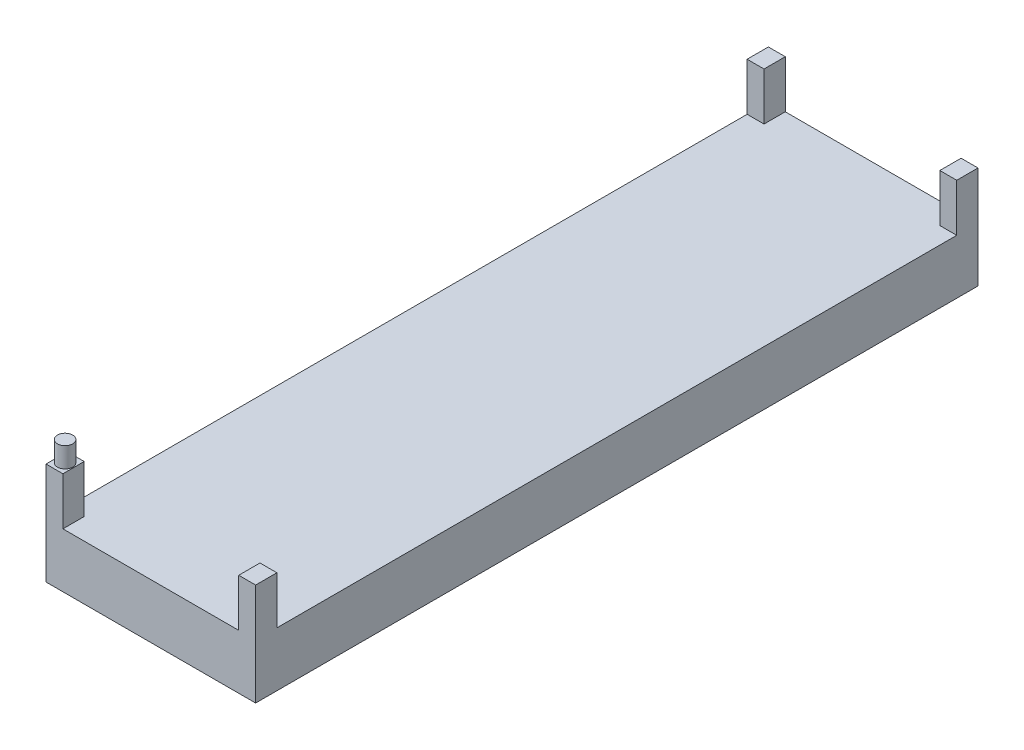
ISO-10303-21;
HEADER;
FILE_DESCRIPTION(('STEP AP214'),'2;1');
FILE_NAME('part.step','',(''),(''),'','','');
FILE_SCHEMA(('AUTOMOTIVE_DESIGN { 1 0 10303 214 1 1 1 1 }'));
ENDSEC;
DATA;
#1=APPLICATION_CONTEXT('core data for automotive mechanical design processes');
#2=APPLICATION_PROTOCOL_DEFINITION('international standard','automotive_design',2000,#1);
#3=PRODUCT_CONTEXT('',#1,'mechanical');
#4=PRODUCT('Part','Part','',(#3));
#5=PRODUCT_RELATED_PRODUCT_CATEGORY('part','',(#4));
#6=PRODUCT_DEFINITION_FORMATION('','',#4);
#7=PRODUCT_DEFINITION_CONTEXT('part definition',#1,'design');
#8=PRODUCT_DEFINITION('design','',#6,#7);
#9=PRODUCT_DEFINITION_SHAPE('','',#8);
#10=(LENGTH_UNIT() NAMED_UNIT(*) SI_UNIT(.MILLI.,.METRE.));
#11=(NAMED_UNIT(*) PLANE_ANGLE_UNIT() SI_UNIT($,.RADIAN.));
#12=(NAMED_UNIT(*) SI_UNIT($,.STERADIAN.) SOLID_ANGLE_UNIT());
#13=UNCERTAINTY_MEASURE_WITH_UNIT(LENGTH_MEASURE(1.E-05),#10,'distance_accuracy_value','');
#14=(GEOMETRIC_REPRESENTATION_CONTEXT(3) GLOBAL_UNCERTAINTY_ASSIGNED_CONTEXT((#13)) GLOBAL_UNIT_ASSIGNED_CONTEXT((#10,
#11,#12)) REPRESENTATION_CONTEXT('',''));
#15=CARTESIAN_POINT('',(0.,0.,0.));
#16=DIRECTION('',(0.,0.,1.));
#17=DIRECTION('',(1.,0.,0.));
#18=AXIS2_PLACEMENT_3D('',#15,#16,#17);
#19=CARTESIAN_POINT('',(-48.8315,47.625,158.369));
#20=DIRECTION('',(0.,-1.,0.));
#21=DIRECTION('',(0.,0.,-1.));
#22=AXIS2_PLACEMENT_3D('',#19,#20,#21);
#23=PLANE('',#22);
#24=DIRECTION('',(0.,0.,1.));
#25=VECTOR('',#24,1.);
#26=CARTESIAN_POINT('',(-48.8315,47.625,168.275));
#27=LINE('',#26,#25);
#28=CARTESIAN_POINT('',(-48.8315,47.625,158.369));
#29=VERTEX_POINT('',#28);
#30=CARTESIAN_POINT('',(-48.8315,47.625,168.275));
#31=VERTEX_POINT('',#30);
#32=EDGE_CURVE('E236',#29,#31,#27,.T.);
#33=ORIENTED_EDGE('',*,*,#32,.T.);
#34=DIRECTION('',(1.,0.,0.));
#35=VECTOR('',#34,1.);
#36=CARTESIAN_POINT('',(-48.8315,47.625,168.275));
#37=LINE('',#36,#35);
#38=CARTESIAN_POINT('',(-40.9575,47.625,168.275));
#39=VERTEX_POINT('',#38);
#40=EDGE_CURVE('E239',#31,#39,#37,.T.);
#41=ORIENTED_EDGE('',*,*,#40,.T.);
#42=DIRECTION('',(0.,0.,-1.));
#43=VECTOR('',#42,1.);
#44=CARTESIAN_POINT('',(-40.9575,47.625,168.275));
#45=LINE('',#44,#43);
#46=CARTESIAN_POINT('',(-40.9575,47.625,158.369));
#47=VERTEX_POINT('',#46);
#48=EDGE_CURVE('E242',#39,#47,#45,.T.);
#49=ORIENTED_EDGE('',*,*,#48,.T.);
#50=DIRECTION('',(-1.,0.,0.));
#51=VECTOR('',#50,1.);
#52=CARTESIAN_POINT('',(-48.8315,47.625,158.369));
#53=LINE('',#52,#51);
#54=EDGE_CURVE('E244',#47,#29,#53,.T.);
#55=ORIENTED_EDGE('',*,*,#54,.T.);
#56=EDGE_LOOP('',(#33,#41,#49,#55));
#57=FACE_BOUND('',#56,.T.);
#58=CARTESIAN_POINT('',(-44.8945,47.625,163.322));
#59=DIRECTION('',(0.,-1.,0.));
#60=DIRECTION('',(0.,0.,-1.));
#61=AXIS2_PLACEMENT_3D('',#58,#59,#60);
#62=CIRCLE('',#61,3.556);
#63=CARTESIAN_POINT('',(-44.8945,47.625,159.766));
#64=VERTEX_POINT('',#63);
#65=EDGE_CURVE('E11',#64,#64,#62,.F.);
#66=ORIENTED_EDGE('',*,*,#65,.F.);
#67=EDGE_LOOP('',(#66));
#68=FACE_BOUND('',#67,.T.);
#69=ADVANCED_FACE('F33',(#57,#68),#23,.F.);
#70=CARTESIAN_POINT('',(-48.8315,25.4,168.275));
#71=DIRECTION('',(0.,1.,0.));
#72=DIRECTION('',(0.,0.,1.));
#73=AXIS2_PLACEMENT_3D('',#70,#71,#72);
#74=PLANE('',#73);
#75=DIRECTION('',(0.,0.,-1.));
#76=VECTOR('',#75,1.);
#77=CARTESIAN_POINT('',(-40.9575,25.4,-168.275));
#78=LINE('',#77,#76);
#79=CARTESIAN_POINT('',(-40.9575,25.4,-158.369));
#80=VERTEX_POINT('',#79);
#81=CARTESIAN_POINT('',(-40.9575,25.4,-168.275));
#82=VERTEX_POINT('',#81);
#83=EDGE_CURVE('E48',#80,#82,#78,.T.);
#84=ORIENTED_EDGE('',*,*,#83,.F.);
#85=DIRECTION('',(1.,0.,0.));
#86=VECTOR('',#85,1.);
#87=CARTESIAN_POINT('',(-48.8315,25.4,-158.369));
#88=LINE('',#87,#86);
#89=CARTESIAN_POINT('',(-48.8315,25.4,-158.369));
#90=VERTEX_POINT('',#89);
#91=EDGE_CURVE('E52',#90,#80,#88,.T.);
#92=ORIENTED_EDGE('',*,*,#91,.F.);
#93=DIRECTION('',(0.,0.,1.));
#94=VECTOR('',#93,1.);
#95=CARTESIAN_POINT('',(-48.8315,25.4,-168.275));
#96=LINE('',#95,#94);
#97=CARTESIAN_POINT('',(-48.8315,25.4,158.369));
#98=VERTEX_POINT('',#97);
#99=EDGE_CURVE('E260',#90,#98,#96,.T.);
#100=ORIENTED_EDGE('',*,*,#99,.T.);
#101=DIRECTION('',(-1.,0.,0.));
#102=VECTOR('',#101,1.);
#103=CARTESIAN_POINT('',(-48.8315,25.4,158.369));
#104=LINE('',#103,#102);
#105=CARTESIAN_POINT('',(-40.9575,25.4,158.369));
#106=VERTEX_POINT('',#105);
#107=EDGE_CURVE('E240',#106,#98,#104,.T.);
#108=ORIENTED_EDGE('',*,*,#107,.F.);
#109=DIRECTION('',(0.,0.,-1.));
#110=VECTOR('',#109,1.);
#111=CARTESIAN_POINT('',(-40.9575,25.4,168.275));
#112=LINE('',#111,#110);
#113=CARTESIAN_POINT('',(-40.9575,25.4,168.275));
#114=VERTEX_POINT('',#113);
#115=EDGE_CURVE('E235',#114,#106,#112,.T.);
#116=ORIENTED_EDGE('',*,*,#115,.F.);
#117=DIRECTION('',(1.,0.,0.));
#118=VECTOR('',#117,1.);
#119=CARTESIAN_POINT('',(-48.8315,25.4,168.275));
#120=LINE('',#119,#118);
#121=CARTESIAN_POINT('',(40.9575,25.4,168.275));
#122=VERTEX_POINT('',#121);
#123=EDGE_CURVE('E261',#114,#122,#120,.T.);
#124=ORIENTED_EDGE('',*,*,#123,.T.);
#125=DIRECTION('',(0.,0.,1.));
#126=VECTOR('',#125,1.);
#127=CARTESIAN_POINT('',(40.9575,25.4,168.275));
#128=LINE('',#127,#126);
#129=CARTESIAN_POINT('',(40.9575,25.4,158.369));
#130=VERTEX_POINT('',#129);
#131=EDGE_CURVE('E215',#130,#122,#128,.T.);
#132=ORIENTED_EDGE('',*,*,#131,.F.);
#133=DIRECTION('',(-1.,0.,0.));
#134=VECTOR('',#133,1.);
#135=CARTESIAN_POINT('',(48.8315,25.4,158.369));
#136=LINE('',#135,#134);
#137=CARTESIAN_POINT('',(48.8315,25.4,158.369));
#138=VERTEX_POINT('',#137);
#139=EDGE_CURVE('E210',#138,#130,#136,.T.);
#140=ORIENTED_EDGE('',*,*,#139,.F.);
#141=DIRECTION('',(0.,0.,-1.));
#142=VECTOR('',#141,1.);
#143=CARTESIAN_POINT('',(48.8315,25.4,-168.275));
#144=LINE('',#143,#142);
#145=CARTESIAN_POINT('',(48.8315,25.4,-158.369));
#146=VERTEX_POINT('',#145);
#147=EDGE_CURVE('E266',#138,#146,#144,.T.);
#148=ORIENTED_EDGE('',*,*,#147,.T.);
#149=DIRECTION('',(1.,0.,0.));
#150=VECTOR('',#149,1.);
#151=CARTESIAN_POINT('',(48.8315,25.4,-158.369));
#152=LINE('',#151,#150);
#153=CARTESIAN_POINT('',(40.9575,25.4,-158.369));
#154=VERTEX_POINT('',#153);
#155=EDGE_CURVE('E190',#154,#146,#152,.T.);
#156=ORIENTED_EDGE('',*,*,#155,.F.);
#157=DIRECTION('',(0.,0.,1.));
#158=VECTOR('',#157,1.);
#159=CARTESIAN_POINT('',(40.9575,25.4,-168.275));
#160=LINE('',#159,#158);
#161=CARTESIAN_POINT('',(40.9575,25.4,-168.275));
#162=VERTEX_POINT('',#161);
#163=EDGE_CURVE('E185',#162,#154,#160,.T.);
#164=ORIENTED_EDGE('',*,*,#163,.F.);
#165=DIRECTION('',(-1.,0.,0.));
#166=VECTOR('',#165,1.);
#167=CARTESIAN_POINT('',(-48.8315,25.4,-168.275));
#168=LINE('',#167,#166);
#169=EDGE_CURVE('E157',#162,#82,#168,.T.);
#170=ORIENTED_EDGE('',*,*,#169,.T.);
#171=EDGE_LOOP('',(#84,#92,#100,#108,#116,#124,#132,#140,#148,#156,#164,#170));
#172=FACE_BOUND('',#171,.T.);
#173=ADVANCED_FACE('F291',(#172),#74,.T.);
#174=CARTESIAN_POINT('',(-48.8315,25.4,-168.275));
#175=DIRECTION('',(1.,0.,0.));
#176=DIRECTION('',(0.,0.,-1.));
#177=AXIS2_PLACEMENT_3D('',#174,#175,#176);
#178=PLANE('',#177);
#179=DIRECTION('',(0.,0.,1.));
#180=VECTOR('',#179,1.);
#181=CARTESIAN_POINT('',(-48.8315,0.,-168.275));
#182=LINE('',#181,#180);
#183=CARTESIAN_POINT('',(-48.8315,0.,-168.275));
#184=VERTEX_POINT('',#183);
#185=CARTESIAN_POINT('',(-48.8315,0.,168.275));
#186=VERTEX_POINT('',#185);
#187=EDGE_CURVE('E277',#184,#186,#182,.T.);
#188=ORIENTED_EDGE('',*,*,#187,.T.);
#189=DIRECTION('',(0.,-1.,0.));
#190=VECTOR('',#189,1.);
#191=CARTESIAN_POINT('',(-48.8315,25.4,168.275));
#192=LINE('',#191,#190);
#193=EDGE_CURVE('E41',#31,#186,#192,.T.);
#194=ORIENTED_EDGE('',*,*,#193,.F.);
#195=ORIENTED_EDGE('',*,*,#32,.F.);
#196=DIRECTION('',(0.,-1.,0.));
#197=VECTOR('',#196,1.);
#198=CARTESIAN_POINT('',(-48.8315,47.625,158.369));
#199=LINE('',#198,#197);
#200=EDGE_CURVE('E246',#29,#98,#199,.T.);
#201=ORIENTED_EDGE('',*,*,#200,.T.);
#202=ORIENTED_EDGE('',*,*,#99,.F.);
#203=DIRECTION('',(0.,-1.,0.));
#204=VECTOR('',#203,1.);
#205=CARTESIAN_POINT('',(-48.8315,47.625,-158.369));
#206=LINE('',#205,#204);
#207=CARTESIAN_POINT('',(-48.8315,47.625,-158.369));
#208=VERTEX_POINT('',#207);
#209=EDGE_CURVE('E162',#208,#90,#206,.T.);
#210=ORIENTED_EDGE('',*,*,#209,.F.);
#211=DIRECTION('',(0.,0.,1.));
#212=VECTOR('',#211,1.);
#213=CARTESIAN_POINT('',(-48.8315,47.625,-168.275));
#214=LINE('',#213,#212);
#215=CARTESIAN_POINT('',(-48.8315,47.625,-168.275));
#216=VERTEX_POINT('',#215);
#217=EDGE_CURVE('E160',#216,#208,#214,.T.);
#218=ORIENTED_EDGE('',*,*,#217,.F.);
#219=DIRECTION('',(0.,-1.,0.));
#220=VECTOR('',#219,1.);
#221=CARTESIAN_POINT('',(-48.8315,25.4,-168.275));
#222=LINE('',#221,#220);
#223=EDGE_CURVE('E144',#216,#184,#222,.T.);
#224=ORIENTED_EDGE('',*,*,#223,.T.);
#225=EDGE_LOOP('',(#188,#194,#195,#201,#202,#210,#218,#224));
#226=FACE_BOUND('',#225,.T.);
#227=ADVANCED_FACE('F35',(#226),#178,.F.);
#228=CARTESIAN_POINT('',(-48.8315,25.4,168.275));
#229=DIRECTION('',(0.,0.,-1.));
#230=DIRECTION('',(-1.,0.,0.));
#231=AXIS2_PLACEMENT_3D('',#228,#229,#230);
#232=PLANE('',#231);
#233=DIRECTION('',(1.,0.,0.));
#234=VECTOR('',#233,1.);
#235=CARTESIAN_POINT('',(-48.8315,0.,168.275));
#236=LINE('',#235,#234);
#237=CARTESIAN_POINT('',(48.8315,0.,168.275));
#238=VERTEX_POINT('',#237);
#239=EDGE_CURVE('E281',#186,#238,#236,.T.);
#240=ORIENTED_EDGE('',*,*,#239,.T.);
#241=DIRECTION('',(0.,-1.,0.));
#242=VECTOR('',#241,1.);
#243=CARTESIAN_POINT('',(48.8315,25.4,168.275));
#244=LINE('',#243,#242);
#245=CARTESIAN_POINT('',(48.8315,47.625,168.275));
#246=VERTEX_POINT('',#245);
#247=EDGE_CURVE('E317',#246,#238,#244,.T.);
#248=ORIENTED_EDGE('',*,*,#247,.F.);
#249=DIRECTION('',(1.,0.,0.));
#250=VECTOR('',#249,1.);
#251=CARTESIAN_POINT('',(48.8315,47.625,168.275));
#252=LINE('',#251,#250);
#253=CARTESIAN_POINT('',(40.9575,47.625,168.275));
#254=VERTEX_POINT('',#253);
#255=EDGE_CURVE('E219',#254,#246,#252,.T.);
#256=ORIENTED_EDGE('',*,*,#255,.F.);
#257=DIRECTION('',(0.,-1.,0.));
#258=VECTOR('',#257,1.);
#259=CARTESIAN_POINT('',(40.9575,47.625,168.275));
#260=LINE('',#259,#258);
#261=EDGE_CURVE('E222',#254,#122,#260,.T.);
#262=ORIENTED_EDGE('',*,*,#261,.T.);
#263=ORIENTED_EDGE('',*,*,#123,.F.);
#264=DIRECTION('',(0.,-1.,0.));
#265=VECTOR('',#264,1.);
#266=CARTESIAN_POINT('',(-40.9575,47.625,168.275));
#267=LINE('',#266,#265);
#268=EDGE_CURVE('E275',#39,#114,#267,.T.);
#269=ORIENTED_EDGE('',*,*,#268,.F.);
#270=ORIENTED_EDGE('',*,*,#40,.F.);
#271=ORIENTED_EDGE('',*,*,#193,.T.);
#272=EDGE_LOOP('',(#240,#248,#256,#262,#263,#269,#270,#271));
#273=FACE_BOUND('',#272,.T.);
#274=ADVANCED_FACE('F293',(#273),#232,.F.);
#275=CARTESIAN_POINT('',(48.8315,25.4,-168.275));
#276=DIRECTION('',(-1.,0.,0.));
#277=DIRECTION('',(0.,0.,1.));
#278=AXIS2_PLACEMENT_3D('',#275,#276,#277);
#279=PLANE('',#278);
#280=DIRECTION('',(0.,0.,-1.));
#281=VECTOR('',#280,1.);
#282=CARTESIAN_POINT('',(48.8315,0.,-168.275));
#283=LINE('',#282,#281);
#284=CARTESIAN_POINT('',(48.8315,0.,-168.275));
#285=VERTEX_POINT('',#284);
#286=EDGE_CURVE('E314',#238,#285,#283,.T.);
#287=ORIENTED_EDGE('',*,*,#286,.T.);
#288=DIRECTION('',(0.,-1.,0.));
#289=VECTOR('',#288,1.);
#290=CARTESIAN_POINT('',(48.8315,25.4,-168.275));
#291=LINE('',#290,#289);
#292=CARTESIAN_POINT('',(48.8315,47.625,-168.275));
#293=VERTEX_POINT('',#292);
#294=EDGE_CURVE('E156',#293,#285,#291,.T.);
#295=ORIENTED_EDGE('',*,*,#294,.F.);
#296=DIRECTION('',(0.,0.,-1.));
#297=VECTOR('',#296,1.);
#298=CARTESIAN_POINT('',(48.8315,47.625,-168.275));
#299=LINE('',#298,#297);
#300=CARTESIAN_POINT('',(48.8315,47.625,-158.369));
#301=VERTEX_POINT('',#300);
#302=EDGE_CURVE('E194',#301,#293,#299,.T.);
#303=ORIENTED_EDGE('',*,*,#302,.F.);
#304=DIRECTION('',(0.,-1.,0.));
#305=VECTOR('',#304,1.);
#306=CARTESIAN_POINT('',(48.8315,47.625,-158.369));
#307=LINE('',#306,#305);
#308=EDGE_CURVE('E197',#301,#146,#307,.T.);
#309=ORIENTED_EDGE('',*,*,#308,.T.);
#310=ORIENTED_EDGE('',*,*,#147,.F.);
#311=DIRECTION('',(0.,-1.,0.));
#312=VECTOR('',#311,1.);
#313=CARTESIAN_POINT('',(48.8315,47.625,158.369));
#314=LINE('',#313,#312);
#315=CARTESIAN_POINT('',(48.8315,47.625,158.369));
#316=VERTEX_POINT('',#315);
#317=EDGE_CURVE('E232',#316,#138,#314,.T.);
#318=ORIENTED_EDGE('',*,*,#317,.F.);
#319=DIRECTION('',(0.,0.,-1.));
#320=VECTOR('',#319,1.);
#321=CARTESIAN_POINT('',(48.8315,47.625,168.275));
#322=LINE('',#321,#320);
#323=EDGE_CURVE('E211',#246,#316,#322,.T.);
#324=ORIENTED_EDGE('',*,*,#323,.F.);
#325=ORIENTED_EDGE('',*,*,#247,.T.);
#326=EDGE_LOOP('',(#287,#295,#303,#309,#310,#318,#324,#325));
#327=FACE_BOUND('',#326,.T.);
#328=ADVANCED_FACE('F307',(#327),#279,.F.);
#329=CARTESIAN_POINT('',(-48.8315,25.4,-168.275));
#330=DIRECTION('',(0.,0.,1.));
#331=DIRECTION('',(1.,0.,0.));
#332=AXIS2_PLACEMENT_3D('',#329,#330,#331);
#333=PLANE('',#332);
#334=DIRECTION('',(-1.,0.,0.));
#335=VECTOR('',#334,1.);
#336=CARTESIAN_POINT('',(-48.8315,0.,-168.275));
#337=LINE('',#336,#335);
#338=EDGE_CURVE('E152',#285,#184,#337,.T.);
#339=ORIENTED_EDGE('',*,*,#338,.T.);
#340=ORIENTED_EDGE('',*,*,#223,.F.);
#341=DIRECTION('',(-1.,0.,0.));
#342=VECTOR('',#341,1.);
#343=CARTESIAN_POINT('',(-48.8315,47.625,-168.275));
#344=LINE('',#343,#342);
#345=CARTESIAN_POINT('',(-40.9575,47.625,-168.275));
#346=VERTEX_POINT('',#345);
#347=EDGE_CURVE('E149',#346,#216,#344,.T.);
#348=ORIENTED_EDGE('',*,*,#347,.F.);
#349=DIRECTION('',(0.,-1.,0.));
#350=VECTOR('',#349,1.);
#351=CARTESIAN_POINT('',(-40.9575,47.625,-168.275));
#352=LINE('',#351,#350);
#353=EDGE_CURVE('E178',#346,#82,#352,.T.);
#354=ORIENTED_EDGE('',*,*,#353,.T.);
#355=ORIENTED_EDGE('',*,*,#169,.F.);
#356=DIRECTION('',(0.,-1.,0.));
#357=VECTOR('',#356,1.);
#358=CARTESIAN_POINT('',(40.9575,47.625,-168.275));
#359=LINE('',#358,#357);
#360=CARTESIAN_POINT('',(40.9575,47.625,-168.275));
#361=VERTEX_POINT('',#360);
#362=EDGE_CURVE('E207',#361,#162,#359,.T.);
#363=ORIENTED_EDGE('',*,*,#362,.F.);
#364=DIRECTION('',(-1.,0.,0.));
#365=VECTOR('',#364,1.);
#366=CARTESIAN_POINT('',(48.8315,47.625,-168.275));
#367=LINE('',#366,#365);
#368=EDGE_CURVE('E186',#293,#361,#367,.T.);
#369=ORIENTED_EDGE('',*,*,#368,.F.);
#370=ORIENTED_EDGE('',*,*,#294,.T.);
#371=EDGE_LOOP('',(#339,#340,#348,#354,#355,#363,#369,#370));
#372=FACE_BOUND('',#371,.T.);
#373=ADVANCED_FACE('F146',(#372),#333,.F.);
#374=CARTESIAN_POINT('',(-48.8315,0.,168.275));
#375=DIRECTION('',(0.,1.,0.));
#376=DIRECTION('',(0.,0.,1.));
#377=AXIS2_PLACEMENT_3D('',#374,#375,#376);
#378=PLANE('',#377);
#379=ORIENTED_EDGE('',*,*,#187,.F.);
#380=ORIENTED_EDGE('',*,*,#338,.F.);
#381=ORIENTED_EDGE('',*,*,#286,.F.);
#382=ORIENTED_EDGE('',*,*,#239,.F.);
#383=EDGE_LOOP('',(#379,#380,#381,#382));
#384=FACE_BOUND('',#383,.T.);
#385=ADVANCED_FACE('F322',(#384),#378,.F.);
#386=CARTESIAN_POINT('',(-40.9575,47.625,168.275));
#387=DIRECTION('',(-1.,0.,0.));
#388=DIRECTION('',(0.,0.,1.));
#389=AXIS2_PLACEMENT_3D('',#386,#387,#388);
#390=PLANE('',#389);
#391=ORIENTED_EDGE('',*,*,#115,.T.);
#392=DIRECTION('',(0.,-1.,0.));
#393=VECTOR('',#392,1.);
#394=CARTESIAN_POINT('',(-40.9575,47.625,158.369));
#395=LINE('',#394,#393);
#396=EDGE_CURVE('E249',#47,#106,#395,.T.);
#397=ORIENTED_EDGE('',*,*,#396,.F.);
#398=ORIENTED_EDGE('',*,*,#48,.F.);
#399=ORIENTED_EDGE('',*,*,#268,.T.);
#400=EDGE_LOOP('',(#391,#397,#398,#399));
#401=FACE_BOUND('',#400,.T.);
#402=ADVANCED_FACE('F289',(#401),#390,.F.);
#403=CARTESIAN_POINT('',(-48.8315,47.625,158.369));
#404=DIRECTION('',(0.,0.,1.));
#405=DIRECTION('',(1.,0.,0.));
#406=AXIS2_PLACEMENT_3D('',#403,#404,#405);
#407=PLANE('',#406);
#408=ORIENTED_EDGE('',*,*,#107,.T.);
#409=ORIENTED_EDGE('',*,*,#200,.F.);
#410=ORIENTED_EDGE('',*,*,#54,.F.);
#411=ORIENTED_EDGE('',*,*,#396,.T.);
#412=EDGE_LOOP('',(#408,#409,#410,#411));
#413=FACE_BOUND('',#412,.T.);
#414=ADVANCED_FACE('F287',(#413),#407,.F.);
#415=CARTESIAN_POINT('',(48.8315,47.625,158.369));
#416=DIRECTION('',(0.,0.,1.));
#417=DIRECTION('',(1.,0.,0.));
#418=AXIS2_PLACEMENT_3D('',#415,#416,#417);
#419=PLANE('',#418);
#420=ORIENTED_EDGE('',*,*,#139,.T.);
#421=DIRECTION('',(0.,-1.,0.));
#422=VECTOR('',#421,1.);
#423=CARTESIAN_POINT('',(40.9575,47.625,158.369));
#424=LINE('',#423,#422);
#425=CARTESIAN_POINT('',(40.9575,47.625,158.369));
#426=VERTEX_POINT('',#425);
#427=EDGE_CURVE('E229',#426,#130,#424,.T.);
#428=ORIENTED_EDGE('',*,*,#427,.F.);
#429=DIRECTION('',(-1.,0.,0.));
#430=VECTOR('',#429,1.);
#431=CARTESIAN_POINT('',(48.8315,47.625,158.369));
#432=LINE('',#431,#430);
#433=EDGE_CURVE('E214',#316,#426,#432,.T.);
#434=ORIENTED_EDGE('',*,*,#433,.F.);
#435=ORIENTED_EDGE('',*,*,#317,.T.);
#436=EDGE_LOOP('',(#420,#428,#434,#435));
#437=FACE_BOUND('',#436,.T.);
#438=ADVANCED_FACE('F303',(#437),#419,.F.);
#439=CARTESIAN_POINT('',(40.9575,47.625,168.275));
#440=DIRECTION('',(1.,0.,0.));
#441=DIRECTION('',(0.,0.,-1.));
#442=AXIS2_PLACEMENT_3D('',#439,#440,#441);
#443=PLANE('',#442);
#444=ORIENTED_EDGE('',*,*,#131,.T.);
#445=ORIENTED_EDGE('',*,*,#261,.F.);
#446=DIRECTION('',(0.,0.,1.));
#447=VECTOR('',#446,1.);
#448=CARTESIAN_POINT('',(40.9575,47.625,168.275));
#449=LINE('',#448,#447);
#450=EDGE_CURVE('E217',#426,#254,#449,.T.);
#451=ORIENTED_EDGE('',*,*,#450,.F.);
#452=ORIENTED_EDGE('',*,*,#427,.T.);
#453=EDGE_LOOP('',(#444,#445,#451,#452));
#454=FACE_BOUND('',#453,.T.);
#455=ADVANCED_FACE('F299',(#454),#443,.F.);
#456=CARTESIAN_POINT('',(48.8315,47.625,158.369));
#457=DIRECTION('',(0.,1.,0.));
#458=DIRECTION('',(0.,0.,1.));
#459=AXIS2_PLACEMENT_3D('',#456,#457,#458);
#460=PLANE('',#459);
#461=ORIENTED_EDGE('',*,*,#323,.T.);
#462=ORIENTED_EDGE('',*,*,#433,.T.);
#463=ORIENTED_EDGE('',*,*,#450,.T.);
#464=ORIENTED_EDGE('',*,*,#255,.T.);
#465=EDGE_LOOP('',(#461,#462,#463,#464));
#466=FACE_BOUND('',#465,.T.);
#467=ADVANCED_FACE('F334',(#466),#460,.T.);
#468=CARTESIAN_POINT('',(40.9575,47.625,-168.275));
#469=DIRECTION('',(1.,0.,0.));
#470=DIRECTION('',(0.,0.,-1.));
#471=AXIS2_PLACEMENT_3D('',#468,#469,#470);
#472=PLANE('',#471);
#473=ORIENTED_EDGE('',*,*,#163,.T.);
#474=DIRECTION('',(0.,-1.,0.));
#475=VECTOR('',#474,1.);
#476=CARTESIAN_POINT('',(40.9575,47.625,-158.369));
#477=LINE('',#476,#475);
#478=CARTESIAN_POINT('',(40.9575,47.625,-158.369));
#479=VERTEX_POINT('',#478);
#480=EDGE_CURVE('E204',#479,#154,#477,.T.);
#481=ORIENTED_EDGE('',*,*,#480,.F.);
#482=DIRECTION('',(0.,0.,1.));
#483=VECTOR('',#482,1.);
#484=CARTESIAN_POINT('',(40.9575,47.625,-168.275));
#485=LINE('',#484,#483);
#486=EDGE_CURVE('E189',#361,#479,#485,.T.);
#487=ORIENTED_EDGE('',*,*,#486,.F.);
#488=ORIENTED_EDGE('',*,*,#362,.T.);
#489=EDGE_LOOP('',(#473,#481,#487,#488));
#490=FACE_BOUND('',#489,.T.);
#491=ADVANCED_FACE('F332',(#490),#472,.F.);
#492=CARTESIAN_POINT('',(48.8315,47.625,-158.369));
#493=DIRECTION('',(0.,0.,-1.));
#494=DIRECTION('',(-1.,0.,0.));
#495=AXIS2_PLACEMENT_3D('',#492,#493,#494);
#496=PLANE('',#495);
#497=ORIENTED_EDGE('',*,*,#155,.T.);
#498=ORIENTED_EDGE('',*,*,#308,.F.);
#499=DIRECTION('',(1.,0.,0.));
#500=VECTOR('',#499,1.);
#501=CARTESIAN_POINT('',(48.8315,47.625,-158.369));
#502=LINE('',#501,#500);
#503=EDGE_CURVE('E192',#479,#301,#502,.T.);
#504=ORIENTED_EDGE('',*,*,#503,.F.);
#505=ORIENTED_EDGE('',*,*,#480,.T.);
#506=EDGE_LOOP('',(#497,#498,#504,#505));
#507=FACE_BOUND('',#506,.T.);
#508=ADVANCED_FACE('F330',(#507),#496,.F.);
#509=CARTESIAN_POINT('',(40.9575,47.625,-168.275));
#510=DIRECTION('',(0.,1.,0.));
#511=DIRECTION('',(0.,0.,1.));
#512=AXIS2_PLACEMENT_3D('',#509,#510,#511);
#513=PLANE('',#512);
#514=ORIENTED_EDGE('',*,*,#368,.T.);
#515=ORIENTED_EDGE('',*,*,#486,.T.);
#516=ORIENTED_EDGE('',*,*,#503,.T.);
#517=ORIENTED_EDGE('',*,*,#302,.T.);
#518=EDGE_LOOP('',(#514,#515,#516,#517));
#519=FACE_BOUND('',#518,.T.);
#520=ADVANCED_FACE('F326',(#519),#513,.T.);
#521=CARTESIAN_POINT('',(-48.8315,47.625,-158.369));
#522=DIRECTION('',(0.,0.,-1.));
#523=DIRECTION('',(-1.,0.,0.));
#524=AXIS2_PLACEMENT_3D('',#521,#522,#523);
#525=PLANE('',#524);
#526=ORIENTED_EDGE('',*,*,#91,.T.);
#527=DIRECTION('',(0.,-1.,0.));
#528=VECTOR('',#527,1.);
#529=CARTESIAN_POINT('',(-40.9575,47.625,-158.369));
#530=LINE('',#529,#528);
#531=CARTESIAN_POINT('',(-40.9575,47.625,-158.369));
#532=VERTEX_POINT('',#531);
#533=EDGE_CURVE('E181',#532,#80,#530,.T.);
#534=ORIENTED_EDGE('',*,*,#533,.F.);
#535=DIRECTION('',(1.,0.,0.));
#536=VECTOR('',#535,1.);
#537=CARTESIAN_POINT('',(-48.8315,47.625,-158.369));
#538=LINE('',#537,#536);
#539=EDGE_CURVE('E165',#208,#532,#538,.T.);
#540=ORIENTED_EDGE('',*,*,#539,.F.);
#541=ORIENTED_EDGE('',*,*,#209,.T.);
#542=EDGE_LOOP('',(#526,#534,#540,#541));
#543=FACE_BOUND('',#542,.T.);
#544=ADVANCED_FACE('F426',(#543),#525,.F.);
#545=CARTESIAN_POINT('',(-40.9575,47.625,-168.275));
#546=DIRECTION('',(-1.,0.,0.));
#547=DIRECTION('',(0.,0.,1.));
#548=AXIS2_PLACEMENT_3D('',#545,#546,#547);
#549=PLANE('',#548);
#550=ORIENTED_EDGE('',*,*,#83,.T.);
#551=ORIENTED_EDGE('',*,*,#353,.F.);
#552=DIRECTION('',(0.,0.,-1.));
#553=VECTOR('',#552,1.);
#554=CARTESIAN_POINT('',(-40.9575,47.625,-168.275));
#555=LINE('',#554,#553);
#556=EDGE_CURVE('E169',#532,#346,#555,.T.);
#557=ORIENTED_EDGE('',*,*,#556,.F.);
#558=ORIENTED_EDGE('',*,*,#533,.T.);
#559=EDGE_LOOP('',(#550,#551,#557,#558));
#560=FACE_BOUND('',#559,.T.);
#561=ADVANCED_FACE('F435',(#560),#549,.F.);
#562=CARTESIAN_POINT('',(-40.9575,47.625,-168.275));
#563=DIRECTION('',(0.,-1.,0.));
#564=DIRECTION('',(0.,0.,-1.));
#565=AXIS2_PLACEMENT_3D('',#562,#563,#564);
#566=PLANE('',#565);
#567=ORIENTED_EDGE('',*,*,#347,.T.);
#568=ORIENTED_EDGE('',*,*,#217,.T.);
#569=ORIENTED_EDGE('',*,*,#539,.T.);
#570=ORIENTED_EDGE('',*,*,#556,.T.);
#571=EDGE_LOOP('',(#567,#568,#569,#570));
#572=FACE_BOUND('',#571,.T.);
#573=ADVANCED_FACE('F167',(#572),#566,.F.);
#574=CARTESIAN_POINT('',(-44.8945,57.023,163.322));
#575=DIRECTION('',(0.,-1.,0.));
#576=DIRECTION('',(0.,0.,-1.));
#577=AXIS2_PLACEMENT_3D('',#574,#575,#576);
#578=CYLINDRICAL_SURFACE('',#577,3.556);
#579=CARTESIAN_POINT('',(-44.8945,57.023,163.322));
#580=DIRECTION('',(0.,1.,0.));
#581=DIRECTION('',(0.,0.,1.));
#582=AXIS2_PLACEMENT_3D('',#579,#580,#581);
#583=CIRCLE('',#582,3.556);
#584=CARTESIAN_POINT('',(-44.8945,57.023,166.878));
#585=VERTEX_POINT('',#584);
#586=EDGE_CURVE('E174',#585,#585,#583,.T.);
#587=ORIENTED_EDGE('',*,*,#586,.F.);
#588=EDGE_LOOP('',(#587));
#589=FACE_BOUND('',#588,.T.);
#590=ORIENTED_EDGE('',*,*,#65,.T.);
#591=EDGE_LOOP('',(#590));
#592=FACE_BOUND('',#591,.T.);
#593=ADVANCED_FACE('F453',(#589,#592),#578,.T.);
#594=CARTESIAN_POINT('',(-44.8945,57.023,163.322));
#595=DIRECTION('',(0.,1.,0.));
#596=DIRECTION('',(0.,0.,1.));
#597=AXIS2_PLACEMENT_3D('',#594,#595,#596);
#598=PLANE('',#597);
#599=ORIENTED_EDGE('',*,*,#586,.T.);
#600=EDGE_LOOP('',(#599));
#601=FACE_BOUND('',#600,.T.);
#602=ADVANCED_FACE('F467',(#601),#598,.T.);
#603=CLOSED_SHELL('',(#69,#173,#227,#274,#328,#373,#385,#402,#414,#438,#455,#467,#491,#508,#520,
#544,#561,#573,#593,#602));
#604=MANIFOLD_SOLID_BREP('B2',#603);
#605=ADVANCED_BREP_SHAPE_REPRESENTATION('',(#18,#604),#14);
#606=SHAPE_DEFINITION_REPRESENTATION(#9,#605);
ENDSEC;
END-ISO-10303-21;
